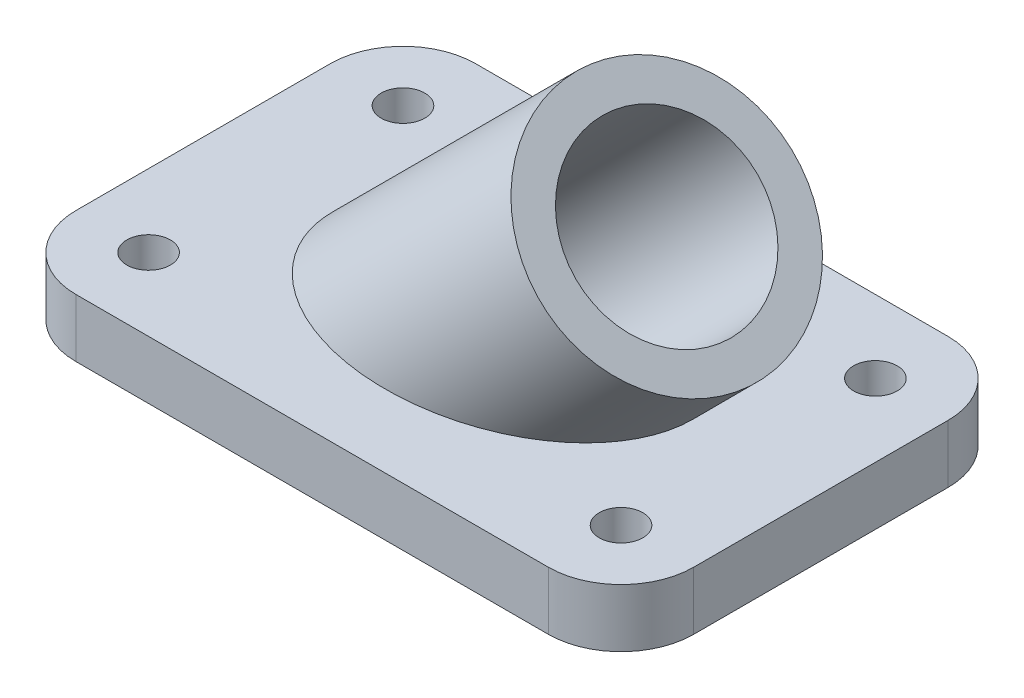
ISO-10303-21;
HEADER;
FILE_DESCRIPTION(('STEP AP214'),'2;1');
FILE_NAME('part.step','',(''),(''),'','','');
FILE_SCHEMA(('AUTOMOTIVE_DESIGN { 1 0 10303 214 1 1 1 1 }'));
ENDSEC;
DATA;
#1=APPLICATION_CONTEXT('core data for automotive mechanical design processes');
#2=APPLICATION_PROTOCOL_DEFINITION('international standard','automotive_design',2000,#1);
#3=PRODUCT_CONTEXT('',#1,'mechanical');
#4=PRODUCT('Part','Part','',(#3));
#5=PRODUCT_RELATED_PRODUCT_CATEGORY('part','',(#4));
#6=PRODUCT_DEFINITION_FORMATION('','',#4);
#7=PRODUCT_DEFINITION_CONTEXT('part definition',#1,'design');
#8=PRODUCT_DEFINITION('design','',#6,#7);
#9=PRODUCT_DEFINITION_SHAPE('','',#8);
#10=(LENGTH_UNIT() NAMED_UNIT(*) SI_UNIT(.MILLI.,.METRE.));
#11=(NAMED_UNIT(*) PLANE_ANGLE_UNIT() SI_UNIT($,.RADIAN.));
#12=(NAMED_UNIT(*) SI_UNIT($,.STERADIAN.) SOLID_ANGLE_UNIT());
#13=UNCERTAINTY_MEASURE_WITH_UNIT(LENGTH_MEASURE(1.E-05),#10,'distance_accuracy_value','');
#14=(GEOMETRIC_REPRESENTATION_CONTEXT(3) GLOBAL_UNCERTAINTY_ASSIGNED_CONTEXT((#13)) GLOBAL_UNIT_ASSIGNED_CONTEXT((#10,
#11,#12)) REPRESENTATION_CONTEXT('',''));
#15=CARTESIAN_POINT('',(0.,0.,0.));
#16=DIRECTION('',(0.,0.,1.));
#17=DIRECTION('',(1.,0.,0.));
#18=AXIS2_PLACEMENT_3D('',#15,#16,#17);
#19=CARTESIAN_POINT('',(-41.275,0.,22.225));
#20=DIRECTION('',(0.,1.,0.));
#21=DIRECTION('',(0.,0.,1.));
#22=AXIS2_PLACEMENT_3D('',#19,#20,#21);
#23=CYLINDRICAL_SURFACE('',#22,3.81);
#24=CARTESIAN_POINT('',(-41.275,0.,22.225));
#25=DIRECTION('',(0.,1.,0.));
#26=DIRECTION('',(0.,0.,1.));
#27=AXIS2_PLACEMENT_3D('',#24,#25,#26);
#28=CIRCLE('',#27,3.81);
#29=CARTESIAN_POINT('',(-41.275,0.,26.035));
#30=VERTEX_POINT('',#29);
#31=EDGE_CURVE('E154',#30,#30,#28,.T.);
#32=ORIENTED_EDGE('',*,*,#31,.F.);
#33=EDGE_LOOP('',(#32));
#34=FACE_BOUND('',#33,.T.);
#35=CARTESIAN_POINT('',(-41.275,10.16,22.225));
#36=DIRECTION('',(0.,1.,0.));
#37=DIRECTION('',(0.,0.,1.));
#38=AXIS2_PLACEMENT_3D('',#35,#36,#37);
#39=CIRCLE('',#38,3.81);
#40=CARTESIAN_POINT('',(-41.275,10.16,26.035));
#41=VERTEX_POINT('',#40);
#42=EDGE_CURVE('E158',#41,#41,#39,.T.);
#43=ORIENTED_EDGE('',*,*,#42,.T.);
#44=EDGE_LOOP('',(#43));
#45=FACE_BOUND('',#44,.T.);
#46=ADVANCED_FACE('F39',(#34,#45),#23,.F.);
#47=CARTESIAN_POINT('',(41.275,0.,22.225));
#48=DIRECTION('',(0.,1.,0.));
#49=DIRECTION('',(0.,0.,1.));
#50=AXIS2_PLACEMENT_3D('',#47,#48,#49);
#51=CYLINDRICAL_SURFACE('',#50,3.81);
#52=CARTESIAN_POINT('',(41.275,0.,22.225));
#53=DIRECTION('',(0.,1.,0.));
#54=DIRECTION('',(0.,0.,1.));
#55=AXIS2_PLACEMENT_3D('',#52,#53,#54);
#56=CIRCLE('',#55,3.81);
#57=CARTESIAN_POINT('',(41.275,0.,26.035));
#58=VERTEX_POINT('',#57);
#59=EDGE_CURVE('E145',#58,#58,#56,.T.);
#60=ORIENTED_EDGE('',*,*,#59,.F.);
#61=EDGE_LOOP('',(#60));
#62=FACE_BOUND('',#61,.T.);
#63=CARTESIAN_POINT('',(41.275,10.16,22.225));
#64=DIRECTION('',(0.,1.,0.));
#65=DIRECTION('',(0.,0.,1.));
#66=AXIS2_PLACEMENT_3D('',#63,#64,#65);
#67=CIRCLE('',#66,3.81);
#68=CARTESIAN_POINT('',(41.275,10.16,26.035));
#69=VERTEX_POINT('',#68);
#70=EDGE_CURVE('E149',#69,#69,#67,.T.);
#71=ORIENTED_EDGE('',*,*,#70,.T.);
#72=EDGE_LOOP('',(#71));
#73=FACE_BOUND('',#72,.T.);
#74=ADVANCED_FACE('F285',(#62,#73),#51,.F.);
#75=CARTESIAN_POINT('',(53.975,10.16,34.925));
#76=DIRECTION('',(-1.,0.,0.));
#77=DIRECTION('',(0.,0.,1.));
#78=AXIS2_PLACEMENT_3D('',#75,#76,#77);
#79=PLANE('',#78);
#80=DIRECTION('',(0.,0.,-1.));
#81=VECTOR('',#80,1.);
#82=CARTESIAN_POINT('',(53.975,0.,34.925));
#83=LINE('',#82,#81);
#84=CARTESIAN_POINT('',(53.975,0.,22.225));
#85=VERTEX_POINT('',#84);
#86=CARTESIAN_POINT('',(53.975,0.,-22.225));
#87=VERTEX_POINT('',#86);
#88=EDGE_CURVE('E141',#85,#87,#83,.T.);
#89=ORIENTED_EDGE('',*,*,#88,.T.);
#90=DIRECTION('',(0.,-1.,0.));
#91=VECTOR('',#90,1.);
#92=CARTESIAN_POINT('',(53.975,10.16,-22.225));
#93=LINE('',#92,#91);
#94=CARTESIAN_POINT('',(53.975,10.16,-22.225));
#95=VERTEX_POINT('',#94);
#96=EDGE_CURVE('E191',#87,#95,#93,.F.);
#97=ORIENTED_EDGE('',*,*,#96,.T.);
#98=DIRECTION('',(0.,0.,-1.));
#99=VECTOR('',#98,1.);
#100=CARTESIAN_POINT('',(53.975,10.16,34.925));
#101=LINE('',#100,#99);
#102=CARTESIAN_POINT('',(53.975,10.16,22.225));
#103=VERTEX_POINT('',#102);
#104=EDGE_CURVE('E139',#103,#95,#101,.T.);
#105=ORIENTED_EDGE('',*,*,#104,.F.);
#106=DIRECTION('',(0.,-1.,0.));
#107=VECTOR('',#106,1.);
#108=CARTESIAN_POINT('',(53.975,10.16,22.225));
#109=LINE('',#108,#107);
#110=EDGE_CURVE('E187',#103,#85,#109,.T.);
#111=ORIENTED_EDGE('',*,*,#110,.T.);
#112=EDGE_LOOP('',(#89,#97,#105,#111));
#113=FACE_BOUND('',#112,.T.);
#114=ADVANCED_FACE('F206',(#113),#79,.F.);
#115=CARTESIAN_POINT('',(-53.975,10.16,-34.925));
#116=DIRECTION('',(0.,0.,1.));
#117=DIRECTION('',(1.,0.,0.));
#118=AXIS2_PLACEMENT_3D('',#115,#116,#117);
#119=PLANE('',#118);
#120=DIRECTION('',(-1.,0.,0.));
#121=VECTOR('',#120,1.);
#122=CARTESIAN_POINT('',(-53.975,0.,-34.925));
#123=LINE('',#122,#121);
#124=CARTESIAN_POINT('',(41.275,0.,-34.925));
#125=VERTEX_POINT('',#124);
#126=CARTESIAN_POINT('',(-41.275,0.,-34.925));
#127=VERTEX_POINT('',#126);
#128=EDGE_CURVE('E135',#125,#127,#123,.T.);
#129=ORIENTED_EDGE('',*,*,#128,.T.);
#130=DIRECTION('',(0.,-1.,0.));
#131=VECTOR('',#130,1.);
#132=CARTESIAN_POINT('',(-41.275,10.16,-34.925));
#133=LINE('',#132,#131);
#134=CARTESIAN_POINT('',(-41.275,10.16,-34.925));
#135=VERTEX_POINT('',#134);
#136=EDGE_CURVE('E110',#127,#135,#133,.F.);
#137=ORIENTED_EDGE('',*,*,#136,.T.);
#138=DIRECTION('',(-1.,0.,0.));
#139=VECTOR('',#138,1.);
#140=CARTESIAN_POINT('',(-53.975,10.16,-34.925));
#141=LINE('',#140,#139);
#142=CARTESIAN_POINT('',(41.275,10.16,-34.925));
#143=VERTEX_POINT('',#142);
#144=EDGE_CURVE('E211',#143,#135,#141,.T.);
#145=ORIENTED_EDGE('',*,*,#144,.F.);
#146=DIRECTION('',(0.,-1.,0.));
#147=VECTOR('',#146,1.);
#148=CARTESIAN_POINT('',(41.275,10.16,-34.925));
#149=LINE('',#148,#147);
#150=EDGE_CURVE('E116',#143,#125,#149,.T.);
#151=ORIENTED_EDGE('',*,*,#150,.T.);
#152=EDGE_LOOP('',(#129,#137,#145,#151));
#153=FACE_BOUND('',#152,.T.);
#154=ADVANCED_FACE('F400',(#153),#119,.F.);
#155=CARTESIAN_POINT('',(-53.975,10.16,34.925));
#156=DIRECTION('',(1.,0.,0.));
#157=DIRECTION('',(0.,0.,-1.));
#158=AXIS2_PLACEMENT_3D('',#155,#156,#157);
#159=PLANE('',#158);
#160=DIRECTION('',(0.,0.,1.));
#161=VECTOR('',#160,1.);
#162=CARTESIAN_POINT('',(-53.975,10.16,34.925));
#163=LINE('',#162,#161);
#164=CARTESIAN_POINT('',(-53.975,10.16,-22.225));
#165=VERTEX_POINT('',#164);
#166=CARTESIAN_POINT('',(-53.975,10.16,22.225));
#167=VERTEX_POINT('',#166);
#168=EDGE_CURVE('E125',#165,#167,#163,.T.);
#169=ORIENTED_EDGE('',*,*,#168,.F.);
#170=DIRECTION('',(0.,-1.,0.));
#171=VECTOR('',#170,1.);
#172=CARTESIAN_POINT('',(-53.975,10.16,-22.225));
#173=LINE('',#172,#171);
#174=CARTESIAN_POINT('',(-53.975,0.,-22.225));
#175=VERTEX_POINT('',#174);
#176=EDGE_CURVE('E109',#165,#175,#173,.T.);
#177=ORIENTED_EDGE('',*,*,#176,.T.);
#178=DIRECTION('',(0.,0.,1.));
#179=VECTOR('',#178,1.);
#180=CARTESIAN_POINT('',(-53.975,0.,34.925));
#181=LINE('',#180,#179);
#182=CARTESIAN_POINT('',(-53.975,0.,22.225));
#183=VERTEX_POINT('',#182);
#184=EDGE_CURVE('E123',#175,#183,#181,.T.);
#185=ORIENTED_EDGE('',*,*,#184,.T.);
#186=DIRECTION('',(0.,-1.,0.));
#187=VECTOR('',#186,1.);
#188=CARTESIAN_POINT('',(-53.975,10.16,22.225));
#189=LINE('',#188,#187);
#190=EDGE_CURVE('E128',#183,#167,#189,.F.);
#191=ORIENTED_EDGE('',*,*,#190,.T.);
#192=EDGE_LOOP('',(#169,#177,#185,#191));
#193=FACE_BOUND('',#192,.T.);
#194=ADVANCED_FACE('F122',(#193),#159,.F.);
#195=CARTESIAN_POINT('',(-53.975,10.16,34.925));
#196=DIRECTION('',(0.,0.,-1.));
#197=DIRECTION('',(-1.,0.,0.));
#198=AXIS2_PLACEMENT_3D('',#195,#196,#197);
#199=PLANE('',#198);
#200=DIRECTION('',(1.,0.,0.));
#201=VECTOR('',#200,1.);
#202=CARTESIAN_POINT('',(-53.975,0.,34.925));
#203=LINE('',#202,#201);
#204=CARTESIAN_POINT('',(-41.275,0.,34.925));
#205=VERTEX_POINT('',#204);
#206=CARTESIAN_POINT('',(41.275,0.,34.925));
#207=VERTEX_POINT('',#206);
#208=EDGE_CURVE('E134',#205,#207,#203,.T.);
#209=ORIENTED_EDGE('',*,*,#208,.T.);
#210=DIRECTION('',(0.,-1.,0.));
#211=VECTOR('',#210,1.);
#212=CARTESIAN_POINT('',(41.275,10.16,34.925));
#213=LINE('',#212,#211);
#214=CARTESIAN_POINT('',(41.275,10.16,34.925));
#215=VERTEX_POINT('',#214);
#216=EDGE_CURVE('E11',#207,#215,#213,.F.);
#217=ORIENTED_EDGE('',*,*,#216,.T.);
#218=DIRECTION('',(1.,0.,0.));
#219=VECTOR('',#218,1.);
#220=CARTESIAN_POINT('',(-53.975,10.16,34.925));
#221=LINE('',#220,#219);
#222=CARTESIAN_POINT('',(-41.275,10.16,34.925));
#223=VERTEX_POINT('',#222);
#224=EDGE_CURVE('E150',#223,#215,#221,.T.);
#225=ORIENTED_EDGE('',*,*,#224,.F.);
#226=DIRECTION('',(0.,-1.,0.));
#227=VECTOR('',#226,1.);
#228=CARTESIAN_POINT('',(-41.275,10.16,34.925));
#229=LINE('',#228,#227);
#230=EDGE_CURVE('E48',#223,#205,#229,.T.);
#231=ORIENTED_EDGE('',*,*,#230,.T.);
#232=EDGE_LOOP('',(#209,#217,#225,#231));
#233=FACE_BOUND('',#232,.T.);
#234=ADVANCED_FACE('F196',(#233),#199,.F.);
#235=CARTESIAN_POINT('',(0.,10.16,0.));
#236=DIRECTION('',(0.,-1.,0.));
#237=DIRECTION('',(0.,0.,-1.));
#238=AXIS2_PLACEMENT_3D('',#235,#236,#237);
#239=PLANE('',#238);
#240=CARTESIAN_POINT('',(0.093463273584983,10.16,0.));
#241=DIRECTION('',(0.,-1.,0.));
#242=DIRECTION('',(1.,0.,0.));
#243=AXIS2_PLACEMENT_3D('',#240,#241,#242);
#244=ELLIPSE('',#243,31.4308964237421,22.225);
#245=CARTESIAN_POINT('',(31.5243596973271,10.16,0.));
#246=VERTEX_POINT('',#245);
#247=EDGE_CURVE('E244',#246,#246,#244,.F.);
#248=ORIENTED_EDGE('',*,*,#247,.F.);
#249=EDGE_LOOP('',(#248));
#250=FACE_BOUND('',#249,.T.);
#251=CARTESIAN_POINT('',(-41.275,10.16,-22.225));
#252=DIRECTION('',(0.,1.,0.));
#253=DIRECTION('',(0.,0.,1.));
#254=AXIS2_PLACEMENT_3D('',#251,#252,#253);
#255=CIRCLE('',#254,3.81);
#256=CARTESIAN_POINT('',(-41.275,10.16,-18.415));
#257=VERTEX_POINT('',#256);
#258=EDGE_CURVE('E231',#257,#257,#255,.T.);
#259=ORIENTED_EDGE('',*,*,#258,.F.);
#260=EDGE_LOOP('',(#259));
#261=FACE_BOUND('',#260,.T.);
#262=CARTESIAN_POINT('',(41.275,10.16,-22.225));
#263=DIRECTION('',(0.,1.,0.));
#264=DIRECTION('',(0.,0.,1.));
#265=AXIS2_PLACEMENT_3D('',#262,#263,#264);
#266=CIRCLE('',#265,3.81);
#267=CARTESIAN_POINT('',(41.275,10.16,-18.415));
#268=VERTEX_POINT('',#267);
#269=EDGE_CURVE('E217',#268,#268,#266,.T.);
#270=ORIENTED_EDGE('',*,*,#269,.F.);
#271=EDGE_LOOP('',(#270));
#272=FACE_BOUND('',#271,.T.);
#273=ORIENTED_EDGE('',*,*,#144,.T.);
#274=CARTESIAN_POINT('',(-41.275,10.16,-22.225));
#275=DIRECTION('',(0.,-1.,0.));
#276=DIRECTION('',(0.,0.,-1.));
#277=AXIS2_PLACEMENT_3D('',#274,#275,#276);
#278=CIRCLE('',#277,12.7);
#279=EDGE_CURVE('E184',#135,#165,#278,.F.);
#280=ORIENTED_EDGE('',*,*,#279,.T.);
#281=ORIENTED_EDGE('',*,*,#168,.T.);
#282=CARTESIAN_POINT('',(-41.275,10.16,22.225));
#283=DIRECTION('',(0.,-1.,0.));
#284=DIRECTION('',(0.,0.,-1.));
#285=AXIS2_PLACEMENT_3D('',#282,#283,#284);
#286=CIRCLE('',#285,12.7);
#287=EDGE_CURVE('E60',#167,#223,#286,.F.);
#288=ORIENTED_EDGE('',*,*,#287,.T.);
#289=ORIENTED_EDGE('',*,*,#224,.T.);
#290=CARTESIAN_POINT('',(41.275,10.16,22.225));
#291=DIRECTION('',(0.,-1.,0.));
#292=DIRECTION('',(0.,0.,-1.));
#293=AXIS2_PLACEMENT_3D('',#290,#291,#292);
#294=CIRCLE('',#293,12.7);
#295=EDGE_CURVE('E178',#215,#103,#294,.F.);
#296=ORIENTED_EDGE('',*,*,#295,.T.);
#297=ORIENTED_EDGE('',*,*,#104,.T.);
#298=CARTESIAN_POINT('',(41.275,10.16,-22.225));
#299=DIRECTION('',(0.,-1.,0.));
#300=DIRECTION('',(0.,0.,-1.));
#301=AXIS2_PLACEMENT_3D('',#298,#299,#300);
#302=CIRCLE('',#301,12.7);
#303=EDGE_CURVE('E181',#95,#143,#302,.F.);
#304=ORIENTED_EDGE('',*,*,#303,.T.);
#305=EDGE_LOOP('',(#273,#280,#281,#288,#289,#296,#297,#304));
#306=FACE_BOUND('',#305,.T.);
#307=ORIENTED_EDGE('',*,*,#70,.F.);
#308=EDGE_LOOP('',(#307));
#309=FACE_BOUND('',#308,.T.);
#310=ORIENTED_EDGE('',*,*,#42,.F.);
#311=EDGE_LOOP('',(#310));
#312=FACE_BOUND('',#311,.T.);
#313=ADVANCED_FACE('F271',(#250,#261,#272,#306,#309,#312),#239,.F.);
#314=CARTESIAN_POINT('',(0.,0.,0.));
#315=DIRECTION('',(0.,-1.,0.));
#316=DIRECTION('',(0.,0.,-1.));
#317=AXIS2_PLACEMENT_3D('',#314,#315,#316);
#318=PLANE('',#317);
#319=CARTESIAN_POINT('',(-10.066536726415,0.,0.));
#320=DIRECTION('',(0.,-1.,0.));
#321=DIRECTION('',(1.,0.,0.));
#322=AXIS2_PLACEMENT_3D('',#319,#320,#321);
#323=ELLIPSE('',#322,22.4506403026729,15.875);
#324=CARTESIAN_POINT('',(12.3841035762579,0.,0.));
#325=VERTEX_POINT('',#324);
#326=EDGE_CURVE('E248',#325,#325,#323,.T.);
#327=ORIENTED_EDGE('',*,*,#326,.F.);
#328=EDGE_LOOP('',(#327));
#329=FACE_BOUND('',#328,.T.);
#330=CARTESIAN_POINT('',(-41.275,0.,-22.225));
#331=DIRECTION('',(0.,1.,0.));
#332=DIRECTION('',(0.,0.,1.));
#333=AXIS2_PLACEMENT_3D('',#330,#331,#332);
#334=CIRCLE('',#333,3.81);
#335=CARTESIAN_POINT('',(-41.275,0.,-18.415));
#336=VERTEX_POINT('',#335);
#337=EDGE_CURVE('E236',#336,#336,#334,.T.);
#338=ORIENTED_EDGE('',*,*,#337,.T.);
#339=EDGE_LOOP('',(#338));
#340=FACE_BOUND('',#339,.T.);
#341=CARTESIAN_POINT('',(41.275,0.,-22.225));
#342=DIRECTION('',(0.,1.,0.));
#343=DIRECTION('',(0.,0.,1.));
#344=AXIS2_PLACEMENT_3D('',#341,#342,#343);
#345=CIRCLE('',#344,3.81);
#346=CARTESIAN_POINT('',(41.275,0.,-18.415));
#347=VERTEX_POINT('',#346);
#348=EDGE_CURVE('E224',#347,#347,#345,.T.);
#349=ORIENTED_EDGE('',*,*,#348,.T.);
#350=EDGE_LOOP('',(#349));
#351=FACE_BOUND('',#350,.T.);
#352=ORIENTED_EDGE('',*,*,#184,.F.);
#353=CARTESIAN_POINT('',(-41.275,0.,-22.225));
#354=DIRECTION('',(0.,-1.,0.));
#355=DIRECTION('',(0.,0.,-1.));
#356=AXIS2_PLACEMENT_3D('',#353,#354,#355);
#357=CIRCLE('',#356,12.7);
#358=EDGE_CURVE('E105',#175,#127,#357,.T.);
#359=ORIENTED_EDGE('',*,*,#358,.T.);
#360=ORIENTED_EDGE('',*,*,#128,.F.);
#361=CARTESIAN_POINT('',(41.275,0.,-22.225));
#362=DIRECTION('',(0.,-1.,0.));
#363=DIRECTION('',(0.,0.,-1.));
#364=AXIS2_PLACEMENT_3D('',#361,#362,#363);
#365=CIRCLE('',#364,12.7);
#366=EDGE_CURVE('E117',#125,#87,#365,.T.);
#367=ORIENTED_EDGE('',*,*,#366,.T.);
#368=ORIENTED_EDGE('',*,*,#88,.F.);
#369=CARTESIAN_POINT('',(41.275,0.,22.225));
#370=DIRECTION('',(0.,-1.,0.));
#371=DIRECTION('',(0.,0.,-1.));
#372=AXIS2_PLACEMENT_3D('',#369,#370,#371);
#373=CIRCLE('',#372,12.7);
#374=EDGE_CURVE('E166',#85,#207,#373,.T.);
#375=ORIENTED_EDGE('',*,*,#374,.T.);
#376=ORIENTED_EDGE('',*,*,#208,.F.);
#377=CARTESIAN_POINT('',(-41.275,0.,22.225));
#378=DIRECTION('',(0.,-1.,0.));
#379=DIRECTION('',(0.,0.,-1.));
#380=AXIS2_PLACEMENT_3D('',#377,#378,#379);
#381=CIRCLE('',#380,12.7);
#382=EDGE_CURVE('E127',#205,#183,#381,.T.);
#383=ORIENTED_EDGE('',*,*,#382,.T.);
#384=EDGE_LOOP('',(#352,#359,#360,#367,#368,#375,#376,#383));
#385=FACE_BOUND('',#384,.T.);
#386=ORIENTED_EDGE('',*,*,#59,.T.);
#387=EDGE_LOOP('',(#386));
#388=FACE_BOUND('',#387,.T.);
#389=ORIENTED_EDGE('',*,*,#31,.T.);
#390=EDGE_LOOP('',(#389));
#391=FACE_BOUND('',#390,.T.);
#392=ADVANCED_FACE('F130',(#329,#340,#351,#385,#388,#391),#318,.T.);
#393=CARTESIAN_POINT('',(41.275,0.,-22.225));
#394=DIRECTION('',(0.,1.,0.));
#395=DIRECTION('',(0.,0.,1.));
#396=AXIS2_PLACEMENT_3D('',#393,#394,#395);
#397=CYLINDRICAL_SURFACE('',#396,3.81);
#398=ORIENTED_EDGE('',*,*,#348,.F.);
#399=EDGE_LOOP('',(#398));
#400=FACE_BOUND('',#399,.T.);
#401=ORIENTED_EDGE('',*,*,#269,.T.);
#402=EDGE_LOOP('',(#401));
#403=FACE_BOUND('',#402,.T.);
#404=ADVANCED_FACE('F356',(#400,#403),#397,.F.);
#405=CARTESIAN_POINT('',(-41.275,0.,-22.225));
#406=DIRECTION('',(0.,1.,0.));
#407=DIRECTION('',(0.,0.,1.));
#408=AXIS2_PLACEMENT_3D('',#405,#406,#407);
#409=CYLINDRICAL_SURFACE('',#408,3.81);
#410=ORIENTED_EDGE('',*,*,#337,.F.);
#411=EDGE_LOOP('',(#410));
#412=FACE_BOUND('',#411,.T.);
#413=ORIENTED_EDGE('',*,*,#258,.T.);
#414=EDGE_LOOP('',(#413));
#415=FACE_BOUND('',#414,.T.);
#416=ADVANCED_FACE('F299',(#412,#415),#409,.F.);
#417=CARTESIAN_POINT('',(-41.275,10.16,-22.225));
#418=DIRECTION('',(0.,-1.,0.));
#419=DIRECTION('',(0.,0.,-1.));
#420=AXIS2_PLACEMENT_3D('',#417,#418,#419);
#421=CYLINDRICAL_SURFACE('',#420,12.7);
#422=ORIENTED_EDGE('',*,*,#279,.F.);
#423=ORIENTED_EDGE('',*,*,#136,.F.);
#424=ORIENTED_EDGE('',*,*,#358,.F.);
#425=ORIENTED_EDGE('',*,*,#176,.F.);
#426=EDGE_LOOP('',(#422,#423,#424,#425));
#427=FACE_BOUND('',#426,.T.);
#428=ADVANCED_FACE('F108',(#427),#421,.T.);
#429=CARTESIAN_POINT('',(41.275,10.16,-22.225));
#430=DIRECTION('',(0.,-1.,0.));
#431=DIRECTION('',(0.,0.,-1.));
#432=AXIS2_PLACEMENT_3D('',#429,#430,#431);
#433=CYLINDRICAL_SURFACE('',#432,12.7);
#434=ORIENTED_EDGE('',*,*,#303,.F.);
#435=ORIENTED_EDGE('',*,*,#96,.F.);
#436=ORIENTED_EDGE('',*,*,#366,.F.);
#437=ORIENTED_EDGE('',*,*,#150,.F.);
#438=EDGE_LOOP('',(#434,#435,#436,#437));
#439=FACE_BOUND('',#438,.T.);
#440=ADVANCED_FACE('F298',(#439),#433,.T.);
#441=CARTESIAN_POINT('',(41.275,10.16,22.225));
#442=DIRECTION('',(0.,-1.,0.));
#443=DIRECTION('',(0.,0.,-1.));
#444=AXIS2_PLACEMENT_3D('',#441,#442,#443);
#445=CYLINDRICAL_SURFACE('',#444,12.7);
#446=ORIENTED_EDGE('',*,*,#295,.F.);
#447=ORIENTED_EDGE('',*,*,#216,.F.);
#448=ORIENTED_EDGE('',*,*,#374,.F.);
#449=ORIENTED_EDGE('',*,*,#110,.F.);
#450=EDGE_LOOP('',(#446,#447,#448,#449));
#451=FACE_BOUND('',#450,.T.);
#452=ADVANCED_FACE('F203',(#451),#445,.T.);
#453=CARTESIAN_POINT('',(-41.275,10.16,22.225));
#454=DIRECTION('',(0.,-1.,0.));
#455=DIRECTION('',(0.,0.,-1.));
#456=AXIS2_PLACEMENT_3D('',#453,#454,#455);
#457=CYLINDRICAL_SURFACE('',#456,12.7);
#458=ORIENTED_EDGE('',*,*,#287,.F.);
#459=ORIENTED_EDGE('',*,*,#190,.F.);
#460=ORIENTED_EDGE('',*,*,#382,.F.);
#461=ORIENTED_EDGE('',*,*,#230,.F.);
#462=EDGE_LOOP('',(#458,#459,#460,#461));
#463=FACE_BOUND('',#462,.T.);
#464=ADVANCED_FACE('F41',(#463),#457,.T.);
#465=CARTESIAN_POINT('',(-32.02218257677,-21.9556458503548,0.));
#466=DIRECTION('',(0.707106781186549,0.707106781186546,0.));
#467=DIRECTION('',(-0.707106781186546,0.707106781186549,0.));
#468=AXIS2_PLACEMENT_3D('',#465,#466,#467);
#469=CYLINDRICAL_SURFACE('',#468,22.225);
#470=CARTESIAN_POINT('',(27.0342316367926,37.1007683632075,0.));
#471=DIRECTION('',(0.707106781186549,0.707106781186546,0.));
#472=DIRECTION('',(-0.707106781186546,0.707106781186549,0.));
#473=AXIS2_PLACEMENT_3D('',#470,#471,#472);
#474=CIRCLE('',#473,22.225);
#475=CARTESIAN_POINT('',(11.3187834249216,52.8162165750786,0.));
#476=VERTEX_POINT('',#475);
#477=EDGE_CURVE('E240',#476,#476,#474,.T.);
#478=ORIENTED_EDGE('',*,*,#477,.F.);
#479=EDGE_LOOP('',(#478));
#480=FACE_BOUND('',#479,.T.);
#481=ORIENTED_EDGE('',*,*,#247,.T.);
#482=EDGE_LOOP('',(#481));
#483=FACE_BOUND('',#482,.T.);
#484=ADVANCED_FACE('F262',(#480,#483),#469,.T.);
#485=CARTESIAN_POINT('',(27.0342316367926,37.1007683632075,0.));
#486=DIRECTION('',(0.707106781186549,0.707106781186546,0.));
#487=DIRECTION('',(-0.707106781186546,0.707106781186549,0.));
#488=AXIS2_PLACEMENT_3D('',#485,#486,#487);
#489=PLANE('',#488);
#490=CARTESIAN_POINT('',(27.0342316367926,37.1007683632075,0.));
#491=DIRECTION('',(0.707106781186549,0.707106781186546,0.));
#492=DIRECTION('',(-0.707106781186546,0.707106781186549,0.));
#493=AXIS2_PLACEMENT_3D('',#490,#491,#492);
#494=CIRCLE('',#493,15.875);
#495=CARTESIAN_POINT('',(15.8089114854562,48.326088514544,0.));
#496=VERTEX_POINT('',#495);
#497=EDGE_CURVE('E252',#496,#496,#494,.T.);
#498=ORIENTED_EDGE('',*,*,#497,.F.);
#499=EDGE_LOOP('',(#498));
#500=FACE_BOUND('',#499,.T.);
#501=ORIENTED_EDGE('',*,*,#477,.T.);
#502=EDGE_LOOP('',(#501));
#503=FACE_BOUND('',#502,.T.);
#504=ADVANCED_FACE('F259',(#500,#503),#489,.T.);
#505=CARTESIAN_POINT('',(-32.0207683632076,-21.9542316367925,0.));
#506=DIRECTION('',(0.707106781186549,0.707106781186546,0.));
#507=DIRECTION('',(-0.707106781186546,0.707106781186549,0.));
#508=AXIS2_PLACEMENT_3D('',#505,#506,#507);
#509=CYLINDRICAL_SURFACE('',#508,15.875);
#510=ORIENTED_EDGE('',*,*,#326,.T.);
#511=EDGE_LOOP('',(#510));
#512=FACE_BOUND('',#511,.T.);
#513=ORIENTED_EDGE('',*,*,#497,.T.);
#514=EDGE_LOOP('',(#513));
#515=FACE_BOUND('',#514,.T.);
#516=ADVANCED_FACE('F257',(#512,#515),#509,.F.);
#517=CLOSED_SHELL('',(#46,#74,#114,#154,#194,#234,#313,#392,#404,#416,#428,#440,#452,#464,#484,
#504,#516));
#518=MANIFOLD_SOLID_BREP('B2',#517);
#519=ADVANCED_BREP_SHAPE_REPRESENTATION('',(#18,#518),#14);
#520=SHAPE_DEFINITION_REPRESENTATION(#9,#519);
ENDSEC;
END-ISO-10303-21;
